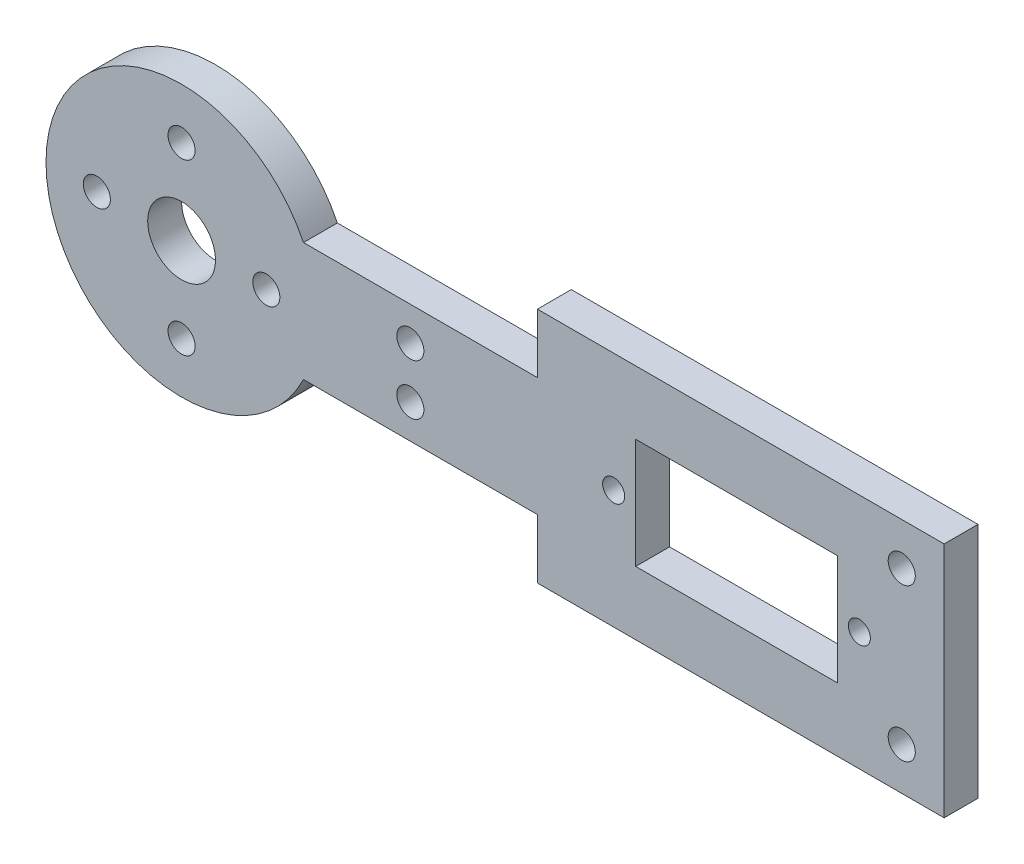
ISO-10303-21;
HEADER;
FILE_DESCRIPTION(('STEP AP214'),'2;1');
FILE_NAME('part.step','',(''),(''),'','','');
FILE_SCHEMA(('AUTOMOTIVE_DESIGN { 1 0 10303 214 1 1 1 1 }'));
ENDSEC;
DATA;
#1=APPLICATION_CONTEXT('core data for automotive mechanical design processes');
#2=APPLICATION_PROTOCOL_DEFINITION('international standard','automotive_design',2000,#1);
#3=PRODUCT_CONTEXT('',#1,'mechanical');
#4=PRODUCT('Part','Part','',(#3));
#5=PRODUCT_RELATED_PRODUCT_CATEGORY('part','',(#4));
#6=PRODUCT_DEFINITION_FORMATION('','',#4);
#7=PRODUCT_DEFINITION_CONTEXT('part definition',#1,'design');
#8=PRODUCT_DEFINITION('design','',#6,#7);
#9=PRODUCT_DEFINITION_SHAPE('','',#8);
#10=(LENGTH_UNIT() NAMED_UNIT(*) SI_UNIT(.MILLI.,.METRE.));
#11=(NAMED_UNIT(*) PLANE_ANGLE_UNIT() SI_UNIT($,.RADIAN.));
#12=(NAMED_UNIT(*) SI_UNIT($,.STERADIAN.) SOLID_ANGLE_UNIT());
#13=UNCERTAINTY_MEASURE_WITH_UNIT(LENGTH_MEASURE(1.E-05),#10,'distance_accuracy_value','');
#14=(GEOMETRIC_REPRESENTATION_CONTEXT(3) GLOBAL_UNCERTAINTY_ASSIGNED_CONTEXT((#13)) GLOBAL_UNIT_ASSIGNED_CONTEXT((#10,
#11,#12)) REPRESENTATION_CONTEXT('',''));
#15=CARTESIAN_POINT('',(0.,0.,0.));
#16=DIRECTION('',(0.,0.,1.));
#17=DIRECTION('',(1.,0.,0.));
#18=AXIS2_PLACEMENT_3D('',#15,#16,#17);
#19=CARTESIAN_POINT('',(0.,0.,4.));
#20=DIRECTION('',(0.,0.,-1.));
#21=DIRECTION('',(-1.,0.,0.));
#22=AXIS2_PLACEMENT_3D('',#19,#20,#21);
#23=PLANE('',#22);
#24=CARTESIAN_POINT('',(85.,-9.,4.));
#25=DIRECTION('',(0.,0.,1.));
#26=DIRECTION('',(1.,0.,0.));
#27=AXIS2_PLACEMENT_3D('',#24,#25,#26);
#28=CIRCLE('',#27,1.6);
#29=CARTESIAN_POINT('',(86.6,-9.,4.));
#30=VERTEX_POINT('',#29);
#31=EDGE_CURVE('E308',#30,#30,#28,.T.);
#32=ORIENTED_EDGE('',*,*,#31,.F.);
#33=EDGE_LOOP('',(#32));
#34=FACE_BOUND('',#33,.T.);
#35=CARTESIAN_POINT('',(85.,9.,4.));
#36=DIRECTION('',(0.,0.,1.));
#37=DIRECTION('',(1.,0.,0.));
#38=AXIS2_PLACEMENT_3D('',#35,#36,#37);
#39=CIRCLE('',#38,1.6);
#40=CARTESIAN_POINT('',(86.6,9.,4.));
#41=VERTEX_POINT('',#40);
#42=EDGE_CURVE('E314',#41,#41,#39,.T.);
#43=ORIENTED_EDGE('',*,*,#42,.F.);
#44=EDGE_LOOP('',(#43));
#45=FACE_BOUND('',#44,.T.);
#46=CARTESIAN_POINT('',(27.,-3.,4.));
#47=DIRECTION('',(0.,0.,1.));
#48=DIRECTION('',(1.,0.,0.));
#49=AXIS2_PLACEMENT_3D('',#46,#47,#48);
#50=CIRCLE('',#49,1.6);
#51=CARTESIAN_POINT('',(28.6,-3.,4.));
#52=VERTEX_POINT('',#51);
#53=EDGE_CURVE('E298',#52,#52,#50,.T.);
#54=ORIENTED_EDGE('',*,*,#53,.F.);
#55=EDGE_LOOP('',(#54));
#56=FACE_BOUND('',#55,.T.);
#57=CARTESIAN_POINT('',(27.,3.,4.));
#58=DIRECTION('',(0.,0.,1.));
#59=DIRECTION('',(1.,0.,0.));
#60=AXIS2_PLACEMENT_3D('',#57,#58,#59);
#61=CIRCLE('',#60,1.6);
#62=CARTESIAN_POINT('',(28.6,3.,4.));
#63=VERTEX_POINT('',#62);
#64=EDGE_CURVE('E315',#63,#63,#61,.T.);
#65=ORIENTED_EDGE('',*,*,#64,.F.);
#66=EDGE_LOOP('',(#65));
#67=FACE_BOUND('',#66,.T.);
#68=CARTESIAN_POINT('',(0.,10.,4.));
#69=DIRECTION('',(0.,0.,1.));
#70=DIRECTION('',(1.,0.,0.));
#71=AXIS2_PLACEMENT_3D('',#68,#69,#70);
#72=CIRCLE('',#71,1.6);
#73=CARTESIAN_POINT('',(1.6,10.,4.));
#74=VERTEX_POINT('',#73);
#75=EDGE_CURVE('E285',#74,#74,#72,.T.);
#76=ORIENTED_EDGE('',*,*,#75,.F.);
#77=EDGE_LOOP('',(#76));
#78=FACE_BOUND('',#77,.T.);
#79=CARTESIAN_POINT('',(0.,-10.,4.));
#80=DIRECTION('',(0.,0.,1.));
#81=DIRECTION('',(1.,0.,0.));
#82=AXIS2_PLACEMENT_3D('',#79,#80,#81);
#83=CIRCLE('',#82,1.6);
#84=CARTESIAN_POINT('',(1.6,-10.,4.));
#85=VERTEX_POINT('',#84);
#86=EDGE_CURVE('E332',#85,#85,#83,.T.);
#87=ORIENTED_EDGE('',*,*,#86,.F.);
#88=EDGE_LOOP('',(#87));
#89=FACE_BOUND('',#88,.T.);
#90=CARTESIAN_POINT('',(10.,0.,4.));
#91=DIRECTION('',(0.,0.,1.));
#92=DIRECTION('',(1.,0.,0.));
#93=AXIS2_PLACEMENT_3D('',#90,#91,#92);
#94=CIRCLE('',#93,1.6);
#95=CARTESIAN_POINT('',(11.6,0.,4.));
#96=VERTEX_POINT('',#95);
#97=EDGE_CURVE('E333',#96,#96,#94,.T.);
#98=ORIENTED_EDGE('',*,*,#97,.F.);
#99=EDGE_LOOP('',(#98));
#100=FACE_BOUND('',#99,.T.);
#101=CARTESIAN_POINT('',(-10.,0.,4.));
#102=DIRECTION('',(0.,0.,1.));
#103=DIRECTION('',(1.,0.,0.));
#104=AXIS2_PLACEMENT_3D('',#101,#102,#103);
#105=CIRCLE('',#104,1.6);
#106=CARTESIAN_POINT('',(-8.4,0.,4.));
#107=VERTEX_POINT('',#106);
#108=EDGE_CURVE('E305',#107,#107,#105,.T.);
#109=ORIENTED_EDGE('',*,*,#108,.F.);
#110=EDGE_LOOP('',(#109));
#111=FACE_BOUND('',#110,.T.);
#112=CARTESIAN_POINT('',(0.,0.,4.));
#113=DIRECTION('',(0.,0.,1.));
#114=DIRECTION('',(1.,0.,0.));
#115=AXIS2_PLACEMENT_3D('',#112,#113,#114);
#116=CIRCLE('',#115,4.);
#117=CARTESIAN_POINT('',(4.,0.,4.));
#118=VERTEX_POINT('',#117);
#119=EDGE_CURVE('E277',#118,#118,#116,.T.);
#120=ORIENTED_EDGE('',*,*,#119,.F.);
#121=EDGE_LOOP('',(#120));
#122=FACE_BOUND('',#121,.T.);
#123=CARTESIAN_POINT('',(51.,0.,4.));
#124=DIRECTION('',(0.,0.,1.));
#125=DIRECTION('',(1.,0.,0.));
#126=AXIS2_PLACEMENT_3D('',#123,#124,#125);
#127=CIRCLE('',#126,1.3);
#128=CARTESIAN_POINT('',(52.3,0.,4.));
#129=VERTEX_POINT('',#128);
#130=EDGE_CURVE('E270',#129,#129,#127,.T.);
#131=ORIENTED_EDGE('',*,*,#130,.F.);
#132=EDGE_LOOP('',(#131));
#133=FACE_BOUND('',#132,.T.);
#134=CARTESIAN_POINT('',(80.,0.,4.));
#135=DIRECTION('',(0.,0.,1.));
#136=DIRECTION('',(1.,0.,0.));
#137=AXIS2_PLACEMENT_3D('',#134,#135,#136);
#138=CIRCLE('',#137,1.3);
#139=CARTESIAN_POINT('',(81.3,0.,4.));
#140=VERTEX_POINT('',#139);
#141=EDGE_CURVE('E274',#140,#140,#138,.T.);
#142=ORIENTED_EDGE('',*,*,#141,.F.);
#143=EDGE_LOOP('',(#142));
#144=FACE_BOUND('',#143,.T.);
#145=DIRECTION('',(0.,-1.,0.));
#146=VECTOR('',#145,1.);
#147=CARTESIAN_POINT('',(42.,-14.,4.));
#148=LINE('',#147,#146);
#149=CARTESIAN_POINT('',(42.,14.,4.));
#150=VERTEX_POINT('',#149);
#151=CARTESIAN_POINT('',(42.,7.,4.));
#152=VERTEX_POINT('',#151);
#153=EDGE_CURVE('E172',#150,#152,#148,.T.);
#154=ORIENTED_EDGE('',*,*,#153,.T.);
#155=DIRECTION('',(-1.,0.,0.));
#156=VECTOR('',#155,1.);
#157=CARTESIAN_POINT('',(0.,7.,4.));
#158=LINE('',#157,#156);
#159=CARTESIAN_POINT('',(14.3874945699382,7.,4.));
#160=VERTEX_POINT('',#159);
#161=EDGE_CURVE('E244',#152,#160,#158,.T.);
#162=ORIENTED_EDGE('',*,*,#161,.T.);
#163=CARTESIAN_POINT('',(0.,0.,4.));
#164=DIRECTION('',(0.,0.,1.));
#165=DIRECTION('',(1.,0.,0.));
#166=AXIS2_PLACEMENT_3D('',#163,#164,#165);
#167=CIRCLE('',#166,16.);
#168=CARTESIAN_POINT('',(14.3874945699382,-7.,4.));
#169=VERTEX_POINT('',#168);
#170=EDGE_CURVE('E223',#160,#169,#167,.T.);
#171=ORIENTED_EDGE('',*,*,#170,.T.);
#172=DIRECTION('',(1.,0.,0.));
#173=VECTOR('',#172,1.);
#174=CARTESIAN_POINT('',(0.,-7.,4.));
#175=LINE('',#174,#173);
#176=CARTESIAN_POINT('',(42.,-7.,4.));
#177=VERTEX_POINT('',#176);
#178=EDGE_CURVE('E241',#169,#177,#175,.T.);
#179=ORIENTED_EDGE('',*,*,#178,.T.);
#180=CARTESIAN_POINT('',(42.,-14.,4.));
#181=VERTEX_POINT('',#180);
#182=EDGE_CURVE('E177',#177,#181,#148,.T.);
#183=ORIENTED_EDGE('',*,*,#182,.T.);
#184=DIRECTION('',(1.,0.,0.));
#185=VECTOR('',#184,1.);
#186=CARTESIAN_POINT('',(42.,-14.,4.));
#187=LINE('',#186,#185);
#188=CARTESIAN_POINT('',(90.,-14.,4.));
#189=VERTEX_POINT('',#188);
#190=EDGE_CURVE('E180',#181,#189,#187,.T.);
#191=ORIENTED_EDGE('',*,*,#190,.T.);
#192=DIRECTION('',(0.,1.,0.));
#193=VECTOR('',#192,1.);
#194=CARTESIAN_POINT('',(90.,-14.,4.));
#195=LINE('',#194,#193);
#196=CARTESIAN_POINT('',(90.,14.,4.));
#197=VERTEX_POINT('',#196);
#198=EDGE_CURVE('E182',#189,#197,#195,.T.);
#199=ORIENTED_EDGE('',*,*,#198,.T.);
#200=DIRECTION('',(-1.,0.,0.));
#201=VECTOR('',#200,1.);
#202=CARTESIAN_POINT('',(42.,14.,4.));
#203=LINE('',#202,#201);
#204=EDGE_CURVE('E184',#197,#150,#203,.T.);
#205=ORIENTED_EDGE('',*,*,#204,.T.);
#206=EDGE_LOOP('',(#154,#162,#171,#179,#183,#191,#199,#205));
#207=FACE_BOUND('',#206,.T.);
#208=DIRECTION('',(0.,-1.,0.));
#209=VECTOR('',#208,1.);
#210=CARTESIAN_POINT('',(53.6,-6.5,4.));
#211=LINE('',#210,#209);
#212=CARTESIAN_POINT('',(53.6,6.5,4.));
#213=VERTEX_POINT('',#212);
#214=CARTESIAN_POINT('',(53.6,-6.5,4.));
#215=VERTEX_POINT('',#214);
#216=EDGE_CURVE('E136',#213,#215,#211,.T.);
#217=ORIENTED_EDGE('',*,*,#216,.F.);
#218=DIRECTION('',(-1.,0.,0.));
#219=VECTOR('',#218,1.);
#220=CARTESIAN_POINT('',(53.6,6.5,4.));
#221=LINE('',#220,#219);
#222=CARTESIAN_POINT('',(77.4,6.5,4.));
#223=VERTEX_POINT('',#222);
#224=EDGE_CURVE('E161',#223,#213,#221,.T.);
#225=ORIENTED_EDGE('',*,*,#224,.F.);
#226=DIRECTION('',(0.,1.,0.));
#227=VECTOR('',#226,1.);
#228=CARTESIAN_POINT('',(77.4,-6.5,4.));
#229=LINE('',#228,#227);
#230=CARTESIAN_POINT('',(77.4,-6.5,4.));
#231=VERTEX_POINT('',#230);
#232=EDGE_CURVE('E160',#231,#223,#229,.T.);
#233=ORIENTED_EDGE('',*,*,#232,.F.);
#234=DIRECTION('',(1.,0.,0.));
#235=VECTOR('',#234,1.);
#236=CARTESIAN_POINT('',(53.6,-6.5,4.));
#237=LINE('',#236,#235);
#238=EDGE_CURVE('E145',#215,#231,#237,.T.);
#239=ORIENTED_EDGE('',*,*,#238,.F.);
#240=EDGE_LOOP('',(#217,#225,#233,#239));
#241=FACE_BOUND('',#240,.T.);
#242=ADVANCED_FACE('F44',(#34,#45,#56,#67,#78,#89,#100,#111,#122,#133,#144,#207,#241),#23,.F.);
#243=CARTESIAN_POINT('',(0.,0.,0.));
#244=DIRECTION('',(0.,0.,-1.));
#245=DIRECTION('',(-1.,0.,0.));
#246=AXIS2_PLACEMENT_3D('',#243,#244,#245);
#247=PLANE('',#246);
#248=CARTESIAN_POINT('',(85.,-9.,0.));
#249=DIRECTION('',(0.,0.,-1.));
#250=DIRECTION('',(-1.,0.,0.));
#251=AXIS2_PLACEMENT_3D('',#248,#249,#250);
#252=CIRCLE('',#251,1.6);
#253=CARTESIAN_POINT('',(83.4,-9.,0.));
#254=VERTEX_POINT('',#253);
#255=EDGE_CURVE('E47',#254,#254,#252,.F.);
#256=ORIENTED_EDGE('',*,*,#255,.T.);
#257=EDGE_LOOP('',(#256));
#258=FACE_BOUND('',#257,.T.);
#259=CARTESIAN_POINT('',(85.,9.,0.));
#260=DIRECTION('',(0.,0.,-1.));
#261=DIRECTION('',(-1.,0.,0.));
#262=AXIS2_PLACEMENT_3D('',#259,#260,#261);
#263=CIRCLE('',#262,1.6);
#264=CARTESIAN_POINT('',(83.4,9.,0.));
#265=VERTEX_POINT('',#264);
#266=EDGE_CURVE('E302',#265,#265,#263,.F.);
#267=ORIENTED_EDGE('',*,*,#266,.T.);
#268=EDGE_LOOP('',(#267));
#269=FACE_BOUND('',#268,.T.);
#270=CARTESIAN_POINT('',(27.,-3.,0.));
#271=DIRECTION('',(0.,0.,-1.));
#272=DIRECTION('',(-1.,0.,0.));
#273=AXIS2_PLACEMENT_3D('',#270,#271,#272);
#274=CIRCLE('',#273,1.6);
#275=CARTESIAN_POINT('',(25.4,-3.,0.));
#276=VERTEX_POINT('',#275);
#277=EDGE_CURVE('E297',#276,#276,#274,.F.);
#278=ORIENTED_EDGE('',*,*,#277,.T.);
#279=EDGE_LOOP('',(#278));
#280=FACE_BOUND('',#279,.T.);
#281=CARTESIAN_POINT('',(27.,3.,0.));
#282=DIRECTION('',(0.,0.,-1.));
#283=DIRECTION('',(-1.,0.,0.));
#284=AXIS2_PLACEMENT_3D('',#281,#282,#283);
#285=CIRCLE('',#284,1.6);
#286=CARTESIAN_POINT('',(25.4,3.,0.));
#287=VERTEX_POINT('',#286);
#288=EDGE_CURVE('E294',#287,#287,#285,.F.);
#289=ORIENTED_EDGE('',*,*,#288,.T.);
#290=EDGE_LOOP('',(#289));
#291=FACE_BOUND('',#290,.T.);
#292=CARTESIAN_POINT('',(0.,10.,0.));
#293=DIRECTION('',(0.,0.,-1.));
#294=DIRECTION('',(-1.,0.,0.));
#295=AXIS2_PLACEMENT_3D('',#292,#293,#294);
#296=CIRCLE('',#295,1.6);
#297=CARTESIAN_POINT('',(-1.6,10.,0.));
#298=VERTEX_POINT('',#297);
#299=EDGE_CURVE('E289',#298,#298,#296,.F.);
#300=ORIENTED_EDGE('',*,*,#299,.T.);
#301=EDGE_LOOP('',(#300));
#302=FACE_BOUND('',#301,.T.);
#303=CARTESIAN_POINT('',(0.,-10.,0.));
#304=DIRECTION('',(0.,0.,-1.));
#305=DIRECTION('',(-1.,0.,0.));
#306=AXIS2_PLACEMENT_3D('',#303,#304,#305);
#307=CIRCLE('',#306,1.6);
#308=CARTESIAN_POINT('',(-1.6,-10.,0.));
#309=VERTEX_POINT('',#308);
#310=EDGE_CURVE('E286',#309,#309,#307,.F.);
#311=ORIENTED_EDGE('',*,*,#310,.T.);
#312=EDGE_LOOP('',(#311));
#313=FACE_BOUND('',#312,.T.);
#314=CARTESIAN_POINT('',(10.,0.,0.));
#315=DIRECTION('',(0.,0.,-1.));
#316=DIRECTION('',(-1.,0.,0.));
#317=AXIS2_PLACEMENT_3D('',#314,#315,#316);
#318=CIRCLE('',#317,1.6);
#319=CARTESIAN_POINT('',(8.4,0.,0.));
#320=VERTEX_POINT('',#319);
#321=EDGE_CURVE('E281',#320,#320,#318,.F.);
#322=ORIENTED_EDGE('',*,*,#321,.T.);
#323=EDGE_LOOP('',(#322));
#324=FACE_BOUND('',#323,.T.);
#325=CARTESIAN_POINT('',(-10.,0.,0.));
#326=DIRECTION('',(0.,0.,-1.));
#327=DIRECTION('',(-1.,0.,0.));
#328=AXIS2_PLACEMENT_3D('',#325,#326,#327);
#329=CIRCLE('',#328,1.6);
#330=CARTESIAN_POINT('',(-11.6,0.,0.));
#331=VERTEX_POINT('',#330);
#332=EDGE_CURVE('E280',#331,#331,#329,.F.);
#333=ORIENTED_EDGE('',*,*,#332,.T.);
#334=EDGE_LOOP('',(#333));
#335=FACE_BOUND('',#334,.T.);
#336=CARTESIAN_POINT('',(0.,0.,0.));
#337=DIRECTION('',(0.,0.,-1.));
#338=DIRECTION('',(-1.,0.,0.));
#339=AXIS2_PLACEMENT_3D('',#336,#337,#338);
#340=CIRCLE('',#339,4.);
#341=CARTESIAN_POINT('',(-4.,0.,0.));
#342=VERTEX_POINT('',#341);
#343=EDGE_CURVE('E271',#342,#342,#340,.F.);
#344=ORIENTED_EDGE('',*,*,#343,.T.);
#345=EDGE_LOOP('',(#344));
#346=FACE_BOUND('',#345,.T.);
#347=CARTESIAN_POINT('',(51.,0.,0.));
#348=DIRECTION('',(0.,0.,-1.));
#349=DIRECTION('',(-1.,0.,0.));
#350=AXIS2_PLACEMENT_3D('',#347,#348,#349);
#351=CIRCLE('',#350,1.3);
#352=CARTESIAN_POINT('',(49.7,0.,0.));
#353=VERTEX_POINT('',#352);
#354=EDGE_CURVE('E144',#353,#353,#351,.F.);
#355=ORIENTED_EDGE('',*,*,#354,.T.);
#356=EDGE_LOOP('',(#355));
#357=FACE_BOUND('',#356,.T.);
#358=CARTESIAN_POINT('',(80.,0.,0.));
#359=DIRECTION('',(0.,0.,-1.));
#360=DIRECTION('',(-1.,0.,0.));
#361=AXIS2_PLACEMENT_3D('',#358,#359,#360);
#362=CIRCLE('',#361,1.3);
#363=CARTESIAN_POINT('',(78.7,0.,0.));
#364=VERTEX_POINT('',#363);
#365=EDGE_CURVE('E263',#364,#364,#362,.F.);
#366=ORIENTED_EDGE('',*,*,#365,.T.);
#367=EDGE_LOOP('',(#366));
#368=FACE_BOUND('',#367,.T.);
#369=DIRECTION('',(-1.,0.,0.));
#370=VECTOR('',#369,1.);
#371=CARTESIAN_POINT('',(0.,7.,0.));
#372=LINE('',#371,#370);
#373=CARTESIAN_POINT('',(42.,7.,0.));
#374=VERTEX_POINT('',#373);
#375=CARTESIAN_POINT('',(14.3874945699382,7.,0.));
#376=VERTEX_POINT('',#375);
#377=EDGE_CURVE('E246',#374,#376,#372,.T.);
#378=ORIENTED_EDGE('',*,*,#377,.F.);
#379=DIRECTION('',(0.,-1.,0.));
#380=VECTOR('',#379,1.);
#381=CARTESIAN_POINT('',(42.,-14.,0.));
#382=LINE('',#381,#380);
#383=CARTESIAN_POINT('',(42.,14.,0.));
#384=VERTEX_POINT('',#383);
#385=EDGE_CURVE('E187',#384,#374,#382,.T.);
#386=ORIENTED_EDGE('',*,*,#385,.F.);
#387=DIRECTION('',(-1.,0.,0.));
#388=VECTOR('',#387,1.);
#389=CARTESIAN_POINT('',(42.,14.,0.));
#390=LINE('',#389,#388);
#391=CARTESIAN_POINT('',(90.,14.,0.));
#392=VERTEX_POINT('',#391);
#393=EDGE_CURVE('E196',#392,#384,#390,.T.);
#394=ORIENTED_EDGE('',*,*,#393,.F.);
#395=DIRECTION('',(0.,1.,0.));
#396=VECTOR('',#395,1.);
#397=CARTESIAN_POINT('',(90.,-14.,0.));
#398=LINE('',#397,#396);
#399=CARTESIAN_POINT('',(90.,-14.,0.));
#400=VERTEX_POINT('',#399);
#401=EDGE_CURVE('E194',#400,#392,#398,.T.);
#402=ORIENTED_EDGE('',*,*,#401,.F.);
#403=DIRECTION('',(1.,0.,0.));
#404=VECTOR('',#403,1.);
#405=CARTESIAN_POINT('',(42.,-14.,0.));
#406=LINE('',#405,#404);
#407=CARTESIAN_POINT('',(42.,-14.,0.));
#408=VERTEX_POINT('',#407);
#409=EDGE_CURVE('E195',#408,#400,#406,.T.);
#410=ORIENTED_EDGE('',*,*,#409,.F.);
#411=CARTESIAN_POINT('',(42.,-7.,0.));
#412=VERTEX_POINT('',#411);
#413=EDGE_CURVE('E153',#412,#408,#382,.T.);
#414=ORIENTED_EDGE('',*,*,#413,.F.);
#415=DIRECTION('',(1.,0.,0.));
#416=VECTOR('',#415,1.);
#417=CARTESIAN_POINT('',(0.,-7.,0.));
#418=LINE('',#417,#416);
#419=CARTESIAN_POINT('',(14.3874945699382,-7.,0.));
#420=VERTEX_POINT('',#419);
#421=EDGE_CURVE('E238',#420,#412,#418,.T.);
#422=ORIENTED_EDGE('',*,*,#421,.F.);
#423=CARTESIAN_POINT('',(0.,0.,0.));
#424=DIRECTION('',(0.,0.,1.));
#425=DIRECTION('',(1.,0.,0.));
#426=AXIS2_PLACEMENT_3D('',#423,#424,#425);
#427=CIRCLE('',#426,16.);
#428=EDGE_CURVE('E221',#376,#420,#427,.T.);
#429=ORIENTED_EDGE('',*,*,#428,.F.);
#430=EDGE_LOOP('',(#378,#386,#394,#402,#410,#414,#422,#429));
#431=FACE_BOUND('',#430,.T.);
#432=DIRECTION('',(-1.,0.,0.));
#433=VECTOR('',#432,1.);
#434=CARTESIAN_POINT('',(0.,6.5,0.));
#435=LINE('',#434,#433);
#436=CARTESIAN_POINT('',(77.4,6.5,0.));
#437=VERTEX_POINT('',#436);
#438=CARTESIAN_POINT('',(53.6,6.5,0.));
#439=VERTEX_POINT('',#438);
#440=EDGE_CURVE('E248',#437,#439,#435,.T.);
#441=ORIENTED_EDGE('',*,*,#440,.T.);
#442=DIRECTION('',(0.,-1.,0.));
#443=VECTOR('',#442,1.);
#444=CARTESIAN_POINT('',(53.6,0.,0.));
#445=LINE('',#444,#443);
#446=CARTESIAN_POINT('',(53.6,-6.5,0.));
#447=VERTEX_POINT('',#446);
#448=EDGE_CURVE('E11',#439,#447,#445,.T.);
#449=ORIENTED_EDGE('',*,*,#448,.T.);
#450=DIRECTION('',(1.,0.,0.));
#451=VECTOR('',#450,1.);
#452=CARTESIAN_POINT('',(0.,-6.5,0.));
#453=LINE('',#452,#451);
#454=CARTESIAN_POINT('',(77.4,-6.5,0.));
#455=VERTEX_POINT('',#454);
#456=EDGE_CURVE('E54',#447,#455,#453,.T.);
#457=ORIENTED_EDGE('',*,*,#456,.T.);
#458=DIRECTION('',(0.,1.,0.));
#459=VECTOR('',#458,1.);
#460=CARTESIAN_POINT('',(77.4,0.,0.));
#461=LINE('',#460,#459);
#462=EDGE_CURVE('E260',#455,#437,#461,.T.);
#463=ORIENTED_EDGE('',*,*,#462,.T.);
#464=EDGE_LOOP('',(#441,#449,#457,#463));
#465=FACE_BOUND('',#464,.T.);
#466=ADVANCED_FACE('F354',(#258,#269,#280,#291,#302,#313,#324,#335,#346,#357,#368,#431,#465),
#247,.T.);
#467=CARTESIAN_POINT('',(0.,-7.,4.));
#468=DIRECTION('',(0.,1.,0.));
#469=DIRECTION('',(0.,0.,1.));
#470=AXIS2_PLACEMENT_3D('',#467,#468,#469);
#471=PLANE('',#470);
#472=DIRECTION('',(0.,0.,-1.));
#473=VECTOR('',#472,1.);
#474=CARTESIAN_POINT('',(42.,-7.,4.));
#475=LINE('',#474,#473);
#476=EDGE_CURVE('E219',#177,#412,#475,.T.);
#477=ORIENTED_EDGE('',*,*,#476,.F.);
#478=ORIENTED_EDGE('',*,*,#178,.F.);
#479=DIRECTION('',(0.,0.,-1.));
#480=VECTOR('',#479,1.);
#481=CARTESIAN_POINT('',(14.3874945699382,-7.,4.));
#482=LINE('',#481,#480);
#483=EDGE_CURVE('E237',#420,#169,#482,.F.);
#484=ORIENTED_EDGE('',*,*,#483,.F.);
#485=ORIENTED_EDGE('',*,*,#421,.T.);
#486=EDGE_LOOP('',(#477,#478,#484,#485));
#487=FACE_BOUND('',#486,.T.);
#488=ADVANCED_FACE('F50',(#487),#471,.F.);
#489=CARTESIAN_POINT('',(0.,7.,4.));
#490=DIRECTION('',(0.,-1.,0.));
#491=DIRECTION('',(0.,0.,-1.));
#492=AXIS2_PLACEMENT_3D('',#489,#490,#491);
#493=PLANE('',#492);
#494=DIRECTION('',(0.,0.,1.));
#495=VECTOR('',#494,1.);
#496=CARTESIAN_POINT('',(42.,7.,4.));
#497=LINE('',#496,#495);
#498=EDGE_CURVE('E216',#374,#152,#497,.T.);
#499=ORIENTED_EDGE('',*,*,#498,.F.);
#500=ORIENTED_EDGE('',*,*,#377,.T.);
#501=DIRECTION('',(0.,0.,-1.));
#502=VECTOR('',#501,1.);
#503=CARTESIAN_POINT('',(14.3874945699382,7.,4.));
#504=LINE('',#503,#502);
#505=EDGE_CURVE('E228',#160,#376,#504,.T.);
#506=ORIENTED_EDGE('',*,*,#505,.F.);
#507=ORIENTED_EDGE('',*,*,#161,.F.);
#508=EDGE_LOOP('',(#499,#500,#506,#507));
#509=FACE_BOUND('',#508,.T.);
#510=ADVANCED_FACE('F370',(#509),#493,.F.);
#511=CARTESIAN_POINT('',(0.,0.,4.));
#512=DIRECTION('',(0.,0.,-1.));
#513=DIRECTION('',(-1.,0.,0.));
#514=AXIS2_PLACEMENT_3D('',#511,#512,#513);
#515=CYLINDRICAL_SURFACE('',#514,16.);
#516=ORIENTED_EDGE('',*,*,#428,.T.);
#517=ORIENTED_EDGE('',*,*,#483,.T.);
#518=ORIENTED_EDGE('',*,*,#170,.F.);
#519=ORIENTED_EDGE('',*,*,#505,.T.);
#520=EDGE_LOOP('',(#516,#517,#518,#519));
#521=FACE_BOUND('',#520,.T.);
#522=ADVANCED_FACE('F374',(#521),#515,.T.);
#523=CARTESIAN_POINT('',(42.,-14.,4.));
#524=DIRECTION('',(1.,0.,0.));
#525=DIRECTION('',(0.,0.,-1.));
#526=AXIS2_PLACEMENT_3D('',#523,#524,#525);
#527=PLANE('',#526);
#528=ORIENTED_EDGE('',*,*,#182,.F.);
#529=ORIENTED_EDGE('',*,*,#476,.T.);
#530=ORIENTED_EDGE('',*,*,#413,.T.);
#531=DIRECTION('',(0.,0.,-1.));
#532=VECTOR('',#531,1.);
#533=CARTESIAN_POINT('',(42.,-14.,4.));
#534=LINE('',#533,#532);
#535=EDGE_CURVE('E215',#181,#408,#534,.T.);
#536=ORIENTED_EDGE('',*,*,#535,.F.);
#537=EDGE_LOOP('',(#528,#529,#530,#536));
#538=FACE_BOUND('',#537,.T.);
#539=ADVANCED_FACE('F385',(#538),#527,.F.);
#540=ORIENTED_EDGE('',*,*,#385,.T.);
#541=ORIENTED_EDGE('',*,*,#498,.T.);
#542=ORIENTED_EDGE('',*,*,#153,.F.);
#543=DIRECTION('',(0.,0.,-1.));
#544=VECTOR('',#543,1.);
#545=CARTESIAN_POINT('',(42.,14.,4.));
#546=LINE('',#545,#544);
#547=EDGE_CURVE('E190',#150,#384,#546,.T.);
#548=ORIENTED_EDGE('',*,*,#547,.T.);
#549=EDGE_LOOP('',(#540,#541,#542,#548));
#550=FACE_BOUND('',#549,.T.);
#551=ADVANCED_FACE('F361',(#550),#527,.F.);
#552=CARTESIAN_POINT('',(42.,-14.,4.));
#553=DIRECTION('',(0.,1.,0.));
#554=DIRECTION('',(0.,0.,1.));
#555=AXIS2_PLACEMENT_3D('',#552,#553,#554);
#556=PLANE('',#555);
#557=ORIENTED_EDGE('',*,*,#409,.T.);
#558=DIRECTION('',(0.,0.,-1.));
#559=VECTOR('',#558,1.);
#560=CARTESIAN_POINT('',(90.,-14.,4.));
#561=LINE('',#560,#559);
#562=EDGE_CURVE('E208',#189,#400,#561,.T.);
#563=ORIENTED_EDGE('',*,*,#562,.F.);
#564=ORIENTED_EDGE('',*,*,#190,.F.);
#565=ORIENTED_EDGE('',*,*,#535,.T.);
#566=EDGE_LOOP('',(#557,#563,#564,#565));
#567=FACE_BOUND('',#566,.T.);
#568=ADVANCED_FACE('F386',(#567),#556,.F.);
#569=CARTESIAN_POINT('',(90.,-14.,4.));
#570=DIRECTION('',(-1.,0.,0.));
#571=DIRECTION('',(0.,0.,1.));
#572=AXIS2_PLACEMENT_3D('',#569,#570,#571);
#573=PLANE('',#572);
#574=ORIENTED_EDGE('',*,*,#401,.T.);
#575=DIRECTION('',(0.,0.,-1.));
#576=VECTOR('',#575,1.);
#577=CARTESIAN_POINT('',(90.,14.,4.));
#578=LINE('',#577,#576);
#579=EDGE_CURVE('E204',#197,#392,#578,.T.);
#580=ORIENTED_EDGE('',*,*,#579,.F.);
#581=ORIENTED_EDGE('',*,*,#198,.F.);
#582=ORIENTED_EDGE('',*,*,#562,.T.);
#583=EDGE_LOOP('',(#574,#580,#581,#582));
#584=FACE_BOUND('',#583,.T.);
#585=ADVANCED_FACE('F392',(#584),#573,.F.);
#586=CARTESIAN_POINT('',(42.,14.,4.));
#587=DIRECTION('',(0.,-1.,0.));
#588=DIRECTION('',(0.,0.,-1.));
#589=AXIS2_PLACEMENT_3D('',#586,#587,#588);
#590=PLANE('',#589);
#591=ORIENTED_EDGE('',*,*,#393,.T.);
#592=ORIENTED_EDGE('',*,*,#547,.F.);
#593=ORIENTED_EDGE('',*,*,#204,.F.);
#594=ORIENTED_EDGE('',*,*,#579,.T.);
#595=EDGE_LOOP('',(#591,#592,#593,#594));
#596=FACE_BOUND('',#595,.T.);
#597=ADVANCED_FACE('F394',(#596),#590,.F.);
#598=CARTESIAN_POINT('',(53.6,-6.5,4.));
#599=DIRECTION('',(1.,0.,0.));
#600=DIRECTION('',(0.,0.,-1.));
#601=AXIS2_PLACEMENT_3D('',#598,#599,#600);
#602=PLANE('',#601);
#603=DIRECTION('',(0.,0.,-1.));
#604=VECTOR('',#603,1.);
#605=CARTESIAN_POINT('',(53.6,6.5,4.));
#606=LINE('',#605,#604);
#607=EDGE_CURVE('E67',#213,#439,#606,.T.);
#608=ORIENTED_EDGE('',*,*,#607,.F.);
#609=ORIENTED_EDGE('',*,*,#216,.T.);
#610=DIRECTION('',(0.,0.,-1.));
#611=VECTOR('',#610,1.);
#612=CARTESIAN_POINT('',(53.6,-6.5,4.));
#613=LINE('',#612,#611);
#614=EDGE_CURVE('E138',#215,#447,#613,.T.);
#615=ORIENTED_EDGE('',*,*,#614,.T.);
#616=ORIENTED_EDGE('',*,*,#448,.F.);
#617=EDGE_LOOP('',(#608,#609,#615,#616));
#618=FACE_BOUND('',#617,.T.);
#619=ADVANCED_FACE('F137',(#618),#602,.T.);
#620=CARTESIAN_POINT('',(53.6,-6.5,4.));
#621=DIRECTION('',(0.,1.,0.));
#622=DIRECTION('',(0.,0.,1.));
#623=AXIS2_PLACEMENT_3D('',#620,#621,#622);
#624=PLANE('',#623);
#625=ORIENTED_EDGE('',*,*,#614,.F.);
#626=ORIENTED_EDGE('',*,*,#238,.T.);
#627=DIRECTION('',(0.,0.,-1.));
#628=VECTOR('',#627,1.);
#629=CARTESIAN_POINT('',(77.4,-6.5,4.));
#630=LINE('',#629,#628);
#631=EDGE_CURVE('E152',#231,#455,#630,.T.);
#632=ORIENTED_EDGE('',*,*,#631,.T.);
#633=ORIENTED_EDGE('',*,*,#456,.F.);
#634=EDGE_LOOP('',(#625,#626,#632,#633));
#635=FACE_BOUND('',#634,.T.);
#636=ADVANCED_FACE('F146',(#635),#624,.T.);
#637=CARTESIAN_POINT('',(77.4,-6.5,4.));
#638=DIRECTION('',(-1.,0.,0.));
#639=DIRECTION('',(0.,0.,1.));
#640=AXIS2_PLACEMENT_3D('',#637,#638,#639);
#641=PLANE('',#640);
#642=ORIENTED_EDGE('',*,*,#631,.F.);
#643=ORIENTED_EDGE('',*,*,#232,.T.);
#644=DIRECTION('',(0.,0.,-1.));
#645=VECTOR('',#644,1.);
#646=CARTESIAN_POINT('',(77.4,6.5,4.));
#647=LINE('',#646,#645);
#648=EDGE_CURVE('E62',#223,#437,#647,.T.);
#649=ORIENTED_EDGE('',*,*,#648,.T.);
#650=ORIENTED_EDGE('',*,*,#462,.F.);
#651=EDGE_LOOP('',(#642,#643,#649,#650));
#652=FACE_BOUND('',#651,.T.);
#653=ADVANCED_FACE('F490',(#652),#641,.T.);
#654=CARTESIAN_POINT('',(53.6,6.5,4.));
#655=DIRECTION('',(0.,-1.,0.));
#656=DIRECTION('',(0.,0.,-1.));
#657=AXIS2_PLACEMENT_3D('',#654,#655,#656);
#658=PLANE('',#657);
#659=ORIENTED_EDGE('',*,*,#648,.F.);
#660=ORIENTED_EDGE('',*,*,#224,.T.);
#661=ORIENTED_EDGE('',*,*,#607,.T.);
#662=ORIENTED_EDGE('',*,*,#440,.F.);
#663=EDGE_LOOP('',(#659,#660,#661,#662));
#664=FACE_BOUND('',#663,.T.);
#665=ADVANCED_FACE('F493',(#664),#658,.T.);
#666=CARTESIAN_POINT('',(80.,0.,4.));
#667=DIRECTION('',(0.,0.,-1.));
#668=DIRECTION('',(-1.,0.,0.));
#669=AXIS2_PLACEMENT_3D('',#666,#667,#668);
#670=CYLINDRICAL_SURFACE('',#669,1.3);
#671=ORIENTED_EDGE('',*,*,#365,.F.);
#672=EDGE_LOOP('',(#671));
#673=FACE_BOUND('',#672,.T.);
#674=ORIENTED_EDGE('',*,*,#141,.T.);
#675=EDGE_LOOP('',(#674));
#676=FACE_BOUND('',#675,.T.);
#677=ADVANCED_FACE('F351',(#673,#676),#670,.F.);
#678=CARTESIAN_POINT('',(51.,0.,4.));
#679=DIRECTION('',(0.,0.,-1.));
#680=DIRECTION('',(-1.,0.,0.));
#681=AXIS2_PLACEMENT_3D('',#678,#679,#680);
#682=CYLINDRICAL_SURFACE('',#681,1.3);
#683=ORIENTED_EDGE('',*,*,#354,.F.);
#684=EDGE_LOOP('',(#683));
#685=FACE_BOUND('',#684,.T.);
#686=ORIENTED_EDGE('',*,*,#130,.T.);
#687=EDGE_LOOP('',(#686));
#688=FACE_BOUND('',#687,.T.);
#689=ADVANCED_FACE('F509',(#685,#688),#682,.F.);
#690=CARTESIAN_POINT('',(0.,0.,4.));
#691=DIRECTION('',(0.,0.,-1.));
#692=DIRECTION('',(-1.,0.,0.));
#693=AXIS2_PLACEMENT_3D('',#690,#691,#692);
#694=CYLINDRICAL_SURFACE('',#693,4.);
#695=ORIENTED_EDGE('',*,*,#343,.F.);
#696=EDGE_LOOP('',(#695));
#697=FACE_BOUND('',#696,.T.);
#698=ORIENTED_EDGE('',*,*,#119,.T.);
#699=EDGE_LOOP('',(#698));
#700=FACE_BOUND('',#699,.T.);
#701=ADVANCED_FACE('F518',(#697,#700),#694,.F.);
#702=CARTESIAN_POINT('',(-10.,0.,4.));
#703=DIRECTION('',(0.,0.,-1.));
#704=DIRECTION('',(-1.,0.,0.));
#705=AXIS2_PLACEMENT_3D('',#702,#703,#704);
#706=CYLINDRICAL_SURFACE('',#705,1.6);
#707=ORIENTED_EDGE('',*,*,#332,.F.);
#708=EDGE_LOOP('',(#707));
#709=FACE_BOUND('',#708,.T.);
#710=ORIENTED_EDGE('',*,*,#108,.T.);
#711=EDGE_LOOP('',(#710));
#712=FACE_BOUND('',#711,.T.);
#713=ADVANCED_FACE('F526',(#709,#712),#706,.F.);
#714=CARTESIAN_POINT('',(10.,0.,4.));
#715=DIRECTION('',(0.,0.,-1.));
#716=DIRECTION('',(-1.,0.,0.));
#717=AXIS2_PLACEMENT_3D('',#714,#715,#716);
#718=CYLINDRICAL_SURFACE('',#717,1.6);
#719=ORIENTED_EDGE('',*,*,#321,.F.);
#720=EDGE_LOOP('',(#719));
#721=FACE_BOUND('',#720,.T.);
#722=ORIENTED_EDGE('',*,*,#97,.T.);
#723=EDGE_LOOP('',(#722));
#724=FACE_BOUND('',#723,.T.);
#725=ADVANCED_FACE('F540',(#721,#724),#718,.F.);
#726=CARTESIAN_POINT('',(0.,-10.,4.));
#727=DIRECTION('',(0.,0.,-1.));
#728=DIRECTION('',(-1.,0.,0.));
#729=AXIS2_PLACEMENT_3D('',#726,#727,#728);
#730=CYLINDRICAL_SURFACE('',#729,1.6);
#731=ORIENTED_EDGE('',*,*,#310,.F.);
#732=EDGE_LOOP('',(#731));
#733=FACE_BOUND('',#732,.T.);
#734=ORIENTED_EDGE('',*,*,#86,.T.);
#735=EDGE_LOOP('',(#734));
#736=FACE_BOUND('',#735,.T.);
#737=ADVANCED_FACE('F546',(#733,#736),#730,.F.);
#738=CARTESIAN_POINT('',(0.,10.,4.));
#739=DIRECTION('',(0.,0.,-1.));
#740=DIRECTION('',(-1.,0.,0.));
#741=AXIS2_PLACEMENT_3D('',#738,#739,#740);
#742=CYLINDRICAL_SURFACE('',#741,1.6);
#743=ORIENTED_EDGE('',*,*,#299,.F.);
#744=EDGE_LOOP('',(#743));
#745=FACE_BOUND('',#744,.T.);
#746=ORIENTED_EDGE('',*,*,#75,.T.);
#747=EDGE_LOOP('',(#746));
#748=FACE_BOUND('',#747,.T.);
#749=ADVANCED_FACE('F553',(#745,#748),#742,.F.);
#750=CARTESIAN_POINT('',(27.,3.,4.));
#751=DIRECTION('',(0.,0.,-1.));
#752=DIRECTION('',(-1.,0.,0.));
#753=AXIS2_PLACEMENT_3D('',#750,#751,#752);
#754=CYLINDRICAL_SURFACE('',#753,1.6);
#755=ORIENTED_EDGE('',*,*,#288,.F.);
#756=EDGE_LOOP('',(#755));
#757=FACE_BOUND('',#756,.T.);
#758=ORIENTED_EDGE('',*,*,#64,.T.);
#759=EDGE_LOOP('',(#758));
#760=FACE_BOUND('',#759,.T.);
#761=ADVANCED_FACE('F563',(#757,#760),#754,.F.);
#762=CARTESIAN_POINT('',(27.,-3.,4.));
#763=DIRECTION('',(0.,0.,-1.));
#764=DIRECTION('',(-1.,0.,0.));
#765=AXIS2_PLACEMENT_3D('',#762,#763,#764);
#766=CYLINDRICAL_SURFACE('',#765,1.6);
#767=ORIENTED_EDGE('',*,*,#277,.F.);
#768=EDGE_LOOP('',(#767));
#769=FACE_BOUND('',#768,.T.);
#770=ORIENTED_EDGE('',*,*,#53,.T.);
#771=EDGE_LOOP('',(#770));
#772=FACE_BOUND('',#771,.T.);
#773=ADVANCED_FACE('F572',(#769,#772),#766,.F.);
#774=CARTESIAN_POINT('',(85.,9.,4.));
#775=DIRECTION('',(0.,0.,-1.));
#776=DIRECTION('',(-1.,0.,0.));
#777=AXIS2_PLACEMENT_3D('',#774,#775,#776);
#778=CYLINDRICAL_SURFACE('',#777,1.6);
#779=ORIENTED_EDGE('',*,*,#266,.F.);
#780=EDGE_LOOP('',(#779));
#781=FACE_BOUND('',#780,.T.);
#782=ORIENTED_EDGE('',*,*,#42,.T.);
#783=EDGE_LOOP('',(#782));
#784=FACE_BOUND('',#783,.T.);
#785=ADVANCED_FACE('F583',(#781,#784),#778,.F.);
#786=CARTESIAN_POINT('',(85.,-9.,4.));
#787=DIRECTION('',(0.,0.,-1.));
#788=DIRECTION('',(-1.,0.,0.));
#789=AXIS2_PLACEMENT_3D('',#786,#787,#788);
#790=CYLINDRICAL_SURFACE('',#789,1.6);
#791=ORIENTED_EDGE('',*,*,#255,.F.);
#792=EDGE_LOOP('',(#791));
#793=FACE_BOUND('',#792,.T.);
#794=ORIENTED_EDGE('',*,*,#31,.T.);
#795=EDGE_LOOP('',(#794));
#796=FACE_BOUND('',#795,.T.);
#797=ADVANCED_FACE('F589',(#793,#796),#790,.F.);
#798=CLOSED_SHELL('',(#242,#466,#488,#510,#522,#539,#551,#568,#585,#597,#619,#636,#653,#665,
#677,#689,#701,#713,#725,#737,#749,#761,#773,#785,#797));
#799=MANIFOLD_SOLID_BREP('B2',#798);
#800=ADVANCED_BREP_SHAPE_REPRESENTATION('',(#18,#799),#14);
#801=SHAPE_DEFINITION_REPRESENTATION(#9,#800);
ENDSEC;
END-ISO-10303-21;
